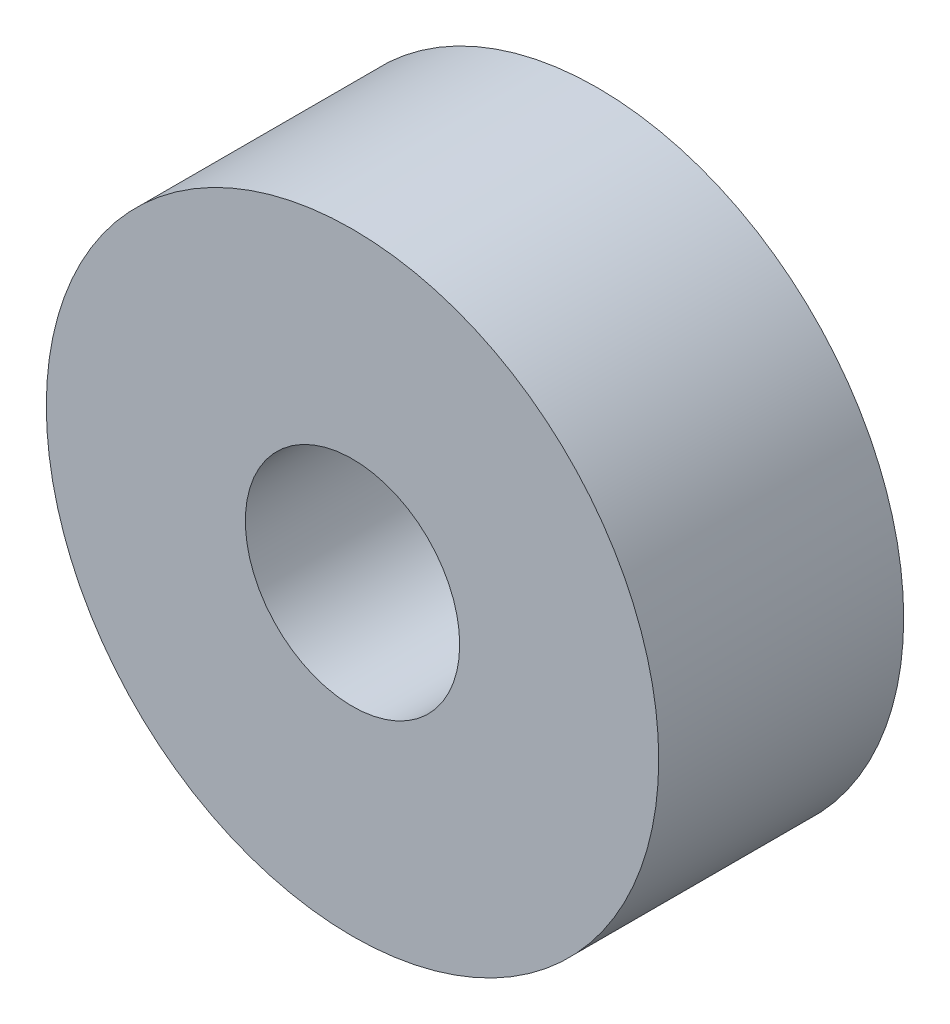
ISO-10303-21;
HEADER;
FILE_DESCRIPTION(('STEP AP214'),'2;1');
FILE_NAME('part.step','',(''),(''),'','','');
FILE_SCHEMA(('AUTOMOTIVE_DESIGN { 1 0 10303 214 1 1 1 1 }'));
ENDSEC;
DATA;
#1=APPLICATION_CONTEXT('core data for automotive mechanical design processes');
#2=APPLICATION_PROTOCOL_DEFINITION('international standard','automotive_design',2000,#1);
#3=PRODUCT_CONTEXT('',#1,'mechanical');
#4=PRODUCT('Part','Part','',(#3));
#5=PRODUCT_RELATED_PRODUCT_CATEGORY('part','',(#4));
#6=PRODUCT_DEFINITION_FORMATION('','',#4);
#7=PRODUCT_DEFINITION_CONTEXT('part definition',#1,'design');
#8=PRODUCT_DEFINITION('design','',#6,#7);
#9=PRODUCT_DEFINITION_SHAPE('','',#8);
#10=(LENGTH_UNIT() NAMED_UNIT(*) SI_UNIT(.MILLI.,.METRE.));
#11=(NAMED_UNIT(*) PLANE_ANGLE_UNIT() SI_UNIT($,.RADIAN.));
#12=(NAMED_UNIT(*) SI_UNIT($,.STERADIAN.) SOLID_ANGLE_UNIT());
#13=UNCERTAINTY_MEASURE_WITH_UNIT(LENGTH_MEASURE(1.E-05),#10,'distance_accuracy_value','');
#14=(GEOMETRIC_REPRESENTATION_CONTEXT(3) GLOBAL_UNCERTAINTY_ASSIGNED_CONTEXT((#13)) GLOBAL_UNIT_ASSIGNED_CONTEXT((#10,
#11,#12)) REPRESENTATION_CONTEXT('',''));
#15=CARTESIAN_POINT('',(0.,0.,0.));
#16=DIRECTION('',(0.,0.,1.));
#17=DIRECTION('',(1.,0.,0.));
#18=AXIS2_PLACEMENT_3D('',#15,#16,#17);
#19=CARTESIAN_POINT('',(0.,0.,20.32));
#20=DIRECTION('',(0.,0.,1.));
#21=DIRECTION('',(1.,0.,0.));
#22=AXIS2_PLACEMENT_3D('',#19,#20,#21);
#23=PLANE('',#22);
#24=CARTESIAN_POINT('',(0.,0.,20.32));
#25=DIRECTION('',(0.,0.,1.));
#26=DIRECTION('',(1.,0.,0.));
#27=AXIS2_PLACEMENT_3D('',#24,#25,#26);
#28=CIRCLE('',#27,25.4);
#29=CARTESIAN_POINT('',(25.4,0.,20.32));
#30=VERTEX_POINT('',#29);
#31=EDGE_CURVE('E10',#30,#30,#28,.T.);
#32=ORIENTED_EDGE('',*,*,#31,.T.);
#33=EDGE_LOOP('',(#32));
#34=FACE_BOUND('',#33,.T.);
#35=CARTESIAN_POINT('',(0.,0.,20.32));
#36=DIRECTION('',(0.,0.,1.));
#37=DIRECTION('',(1.,0.,0.));
#38=AXIS2_PLACEMENT_3D('',#35,#36,#37);
#39=CIRCLE('',#38,8.89);
#40=CARTESIAN_POINT('',(8.89,0.,20.32));
#41=VERTEX_POINT('',#40);
#42=EDGE_CURVE('E50',#41,#41,#39,.T.);
#43=ORIENTED_EDGE('',*,*,#42,.F.);
#44=EDGE_LOOP('',(#43));
#45=FACE_BOUND('',#44,.T.);
#46=ADVANCED_FACE('F37',(#34,#45),#23,.T.);
#47=CARTESIAN_POINT('',(0.,0.,0.));
#48=DIRECTION('',(0.,0.,1.));
#49=DIRECTION('',(1.,0.,0.));
#50=AXIS2_PLACEMENT_3D('',#47,#48,#49);
#51=PLANE('',#50);
#52=CARTESIAN_POINT('',(0.,0.,0.));
#53=DIRECTION('',(0.,0.,1.));
#54=DIRECTION('',(1.,0.,0.));
#55=AXIS2_PLACEMENT_3D('',#52,#53,#54);
#56=CIRCLE('',#55,25.4);
#57=CARTESIAN_POINT('',(25.4,0.,0.));
#58=VERTEX_POINT('',#57);
#59=EDGE_CURVE('E41',#58,#58,#56,.T.);
#60=ORIENTED_EDGE('',*,*,#59,.F.);
#61=EDGE_LOOP('',(#60));
#62=FACE_BOUND('',#61,.T.);
#63=CARTESIAN_POINT('',(0.,0.,0.));
#64=DIRECTION('',(0.,0.,1.));
#65=DIRECTION('',(1.,0.,0.));
#66=AXIS2_PLACEMENT_3D('',#63,#64,#65);
#67=CIRCLE('',#66,8.89);
#68=CARTESIAN_POINT('',(8.89,0.,0.));
#69=VERTEX_POINT('',#68);
#70=EDGE_CURVE('E52',#69,#69,#67,.T.);
#71=ORIENTED_EDGE('',*,*,#70,.T.);
#72=EDGE_LOOP('',(#71));
#73=FACE_BOUND('',#72,.T.);
#74=ADVANCED_FACE('F64',(#62,#73),#51,.F.);
#75=CARTESIAN_POINT('',(0.,0.,20.32));
#76=DIRECTION('',(0.,0.,-1.));
#77=DIRECTION('',(-1.,0.,0.));
#78=AXIS2_PLACEMENT_3D('',#75,#76,#77);
#79=CYLINDRICAL_SURFACE('',#78,25.4);
#80=ORIENTED_EDGE('',*,*,#31,.F.);
#81=EDGE_LOOP('',(#80));
#82=FACE_BOUND('',#81,.T.);
#83=ORIENTED_EDGE('',*,*,#59,.T.);
#84=EDGE_LOOP('',(#83));
#85=FACE_BOUND('',#84,.T.);
#86=ADVANCED_FACE('F39',(#82,#85),#79,.T.);
#87=CARTESIAN_POINT('',(0.,0.,20.32));
#88=DIRECTION('',(0.,0.,-1.));
#89=DIRECTION('',(-1.,0.,0.));
#90=AXIS2_PLACEMENT_3D('',#87,#88,#89);
#91=CYLINDRICAL_SURFACE('',#90,8.89);
#92=ORIENTED_EDGE('',*,*,#42,.T.);
#93=EDGE_LOOP('',(#92));
#94=FACE_BOUND('',#93,.T.);
#95=ORIENTED_EDGE('',*,*,#70,.F.);
#96=EDGE_LOOP('',(#95));
#97=FACE_BOUND('',#96,.T.);
#98=ADVANCED_FACE('F60',(#94,#97),#91,.F.);
#99=CLOSED_SHELL('',(#46,#74,#86,#98));
#100=MANIFOLD_SOLID_BREP('B2',#99);
#101=ADVANCED_BREP_SHAPE_REPRESENTATION('',(#18,#100),#14);
#102=SHAPE_DEFINITION_REPRESENTATION(#9,#101);
ENDSEC;
END-ISO-10303-21;
